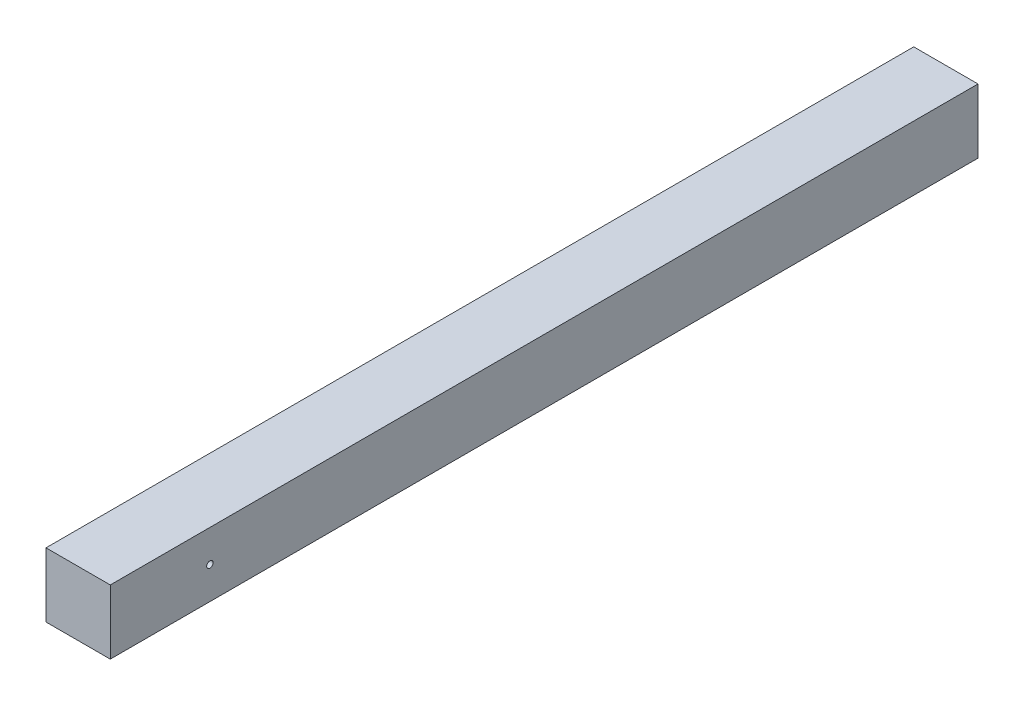
ISO-10303-21;
HEADER;
FILE_DESCRIPTION(('STEP AP214'),'2;1');
FILE_NAME('part.step','',(''),(''),'','','');
FILE_SCHEMA(('AUTOMOTIVE_DESIGN { 1 0 10303 214 1 1 1 1 }'));
ENDSEC;
DATA;
#1=APPLICATION_CONTEXT('core data for automotive mechanical design processes');
#2=APPLICATION_PROTOCOL_DEFINITION('international standard','automotive_design',2000,#1);
#3=PRODUCT_CONTEXT('',#1,'mechanical');
#4=PRODUCT('Part','Part','',(#3));
#5=PRODUCT_RELATED_PRODUCT_CATEGORY('part','',(#4));
#6=PRODUCT_DEFINITION_FORMATION('','',#4);
#7=PRODUCT_DEFINITION_CONTEXT('part definition',#1,'design');
#8=PRODUCT_DEFINITION('design','',#6,#7);
#9=PRODUCT_DEFINITION_SHAPE('','',#8);
#10=(LENGTH_UNIT() NAMED_UNIT(*) SI_UNIT(.MILLI.,.METRE.));
#11=(NAMED_UNIT(*) PLANE_ANGLE_UNIT() SI_UNIT($,.RADIAN.));
#12=(NAMED_UNIT(*) SI_UNIT($,.STERADIAN.) SOLID_ANGLE_UNIT());
#13=UNCERTAINTY_MEASURE_WITH_UNIT(LENGTH_MEASURE(1.E-05),#10,'distance_accuracy_value','');
#14=(GEOMETRIC_REPRESENTATION_CONTEXT(3) GLOBAL_UNCERTAINTY_ASSIGNED_CONTEXT((#13)) GLOBAL_UNIT_ASSIGNED_CONTEXT((#10,
#11,#12)) REPRESENTATION_CONTEXT('',''));
#15=CARTESIAN_POINT('',(0.,0.,0.));
#16=DIRECTION('',(0.,0.,1.));
#17=DIRECTION('',(1.,0.,0.));
#18=AXIS2_PLACEMENT_3D('',#15,#16,#17);
#19=CARTESIAN_POINT('',(50.,50.,675.));
#20=DIRECTION('',(-1.,0.,0.));
#21=DIRECTION('',(0.,0.,1.));
#22=AXIS2_PLACEMENT_3D('',#19,#20,#21);
#23=PLANE('',#22);
#24=CARTESIAN_POINT('',(50.,0.,520.));
#25=DIRECTION('',(-1.,0.,0.));
#26=DIRECTION('',(0.,0.,1.));
#27=AXIS2_PLACEMENT_3D('',#24,#25,#26);
#28=CIRCLE('',#27,5.00000000000004);
#29=CARTESIAN_POINT('',(50.,0.,525.));
#30=VERTEX_POINT('',#29);
#31=EDGE_CURVE('E103',#30,#30,#28,.T.);
#32=ORIENTED_EDGE('',*,*,#31,.T.);
#33=EDGE_LOOP('',(#32));
#34=FACE_BOUND('',#33,.T.);
#35=DIRECTION('',(0.,1.,0.));
#36=VECTOR('',#35,1.);
#37=CARTESIAN_POINT('',(50.,50.,-675.));
#38=LINE('',#37,#36);
#39=CARTESIAN_POINT('',(50.,-50.,-675.));
#40=VERTEX_POINT('',#39);
#41=CARTESIAN_POINT('',(50.,50.,-675.));
#42=VERTEX_POINT('',#41);
#43=EDGE_CURVE('E100',#40,#42,#38,.T.);
#44=ORIENTED_EDGE('',*,*,#43,.T.);
#45=DIRECTION('',(0.,0.,-1.));
#46=VECTOR('',#45,1.);
#47=CARTESIAN_POINT('',(50.,50.,675.));
#48=LINE('',#47,#46);
#49=CARTESIAN_POINT('',(50.,50.,675.));
#50=VERTEX_POINT('',#49);
#51=EDGE_CURVE('E11',#50,#42,#48,.T.);
#52=ORIENTED_EDGE('',*,*,#51,.F.);
#53=DIRECTION('',(0.,1.,0.));
#54=VECTOR('',#53,1.);
#55=CARTESIAN_POINT('',(50.,50.,675.));
#56=LINE('',#55,#54);
#57=CARTESIAN_POINT('',(50.,-50.,675.));
#58=VERTEX_POINT('',#57);
#59=EDGE_CURVE('E88',#58,#50,#56,.T.);
#60=ORIENTED_EDGE('',*,*,#59,.F.);
#61=DIRECTION('',(0.,0.,-1.));
#62=VECTOR('',#61,1.);
#63=CARTESIAN_POINT('',(50.,-50.,675.));
#64=LINE('',#63,#62);
#65=EDGE_CURVE('E96',#58,#40,#64,.T.);
#66=ORIENTED_EDGE('',*,*,#65,.T.);
#67=EDGE_LOOP('',(#44,#52,#60,#66));
#68=FACE_BOUND('',#67,.T.);
#69=ADVANCED_FACE('F37',(#34,#68),#23,.F.);
#70=CARTESIAN_POINT('',(-50.,50.,675.));
#71=DIRECTION('',(0.,-1.,0.));
#72=DIRECTION('',(0.,0.,-1.));
#73=AXIS2_PLACEMENT_3D('',#70,#71,#72);
#74=PLANE('',#73);
#75=DIRECTION('',(-1.,0.,0.));
#76=VECTOR('',#75,1.);
#77=CARTESIAN_POINT('',(-50.,50.,-675.));
#78=LINE('',#77,#76);
#79=CARTESIAN_POINT('',(-50.,50.,-675.));
#80=VERTEX_POINT('',#79);
#81=EDGE_CURVE('E92',#42,#80,#78,.T.);
#82=ORIENTED_EDGE('',*,*,#81,.T.);
#83=DIRECTION('',(0.,0.,-1.));
#84=VECTOR('',#83,1.);
#85=CARTESIAN_POINT('',(-50.,50.,675.));
#86=LINE('',#85,#84);
#87=CARTESIAN_POINT('',(-50.,50.,675.));
#88=VERTEX_POINT('',#87);
#89=EDGE_CURVE('E45',#88,#80,#86,.T.);
#90=ORIENTED_EDGE('',*,*,#89,.F.);
#91=DIRECTION('',(-1.,0.,0.));
#92=VECTOR('',#91,1.);
#93=CARTESIAN_POINT('',(-50.,50.,675.));
#94=LINE('',#93,#92);
#95=EDGE_CURVE('E83',#50,#88,#94,.T.);
#96=ORIENTED_EDGE('',*,*,#95,.F.);
#97=ORIENTED_EDGE('',*,*,#51,.T.);
#98=EDGE_LOOP('',(#82,#90,#96,#97));
#99=FACE_BOUND('',#98,.T.);
#100=ADVANCED_FACE('F91',(#99),#74,.F.);
#101=CARTESIAN_POINT('',(-50.,50.,675.));
#102=DIRECTION('',(1.,0.,0.));
#103=DIRECTION('',(0.,0.,-1.));
#104=AXIS2_PLACEMENT_3D('',#101,#102,#103);
#105=PLANE('',#104);
#106=CARTESIAN_POINT('',(-50.,0.,520.));
#107=DIRECTION('',(-1.,0.,0.));
#108=DIRECTION('',(0.,0.,1.));
#109=AXIS2_PLACEMENT_3D('',#106,#107,#108);
#110=CIRCLE('',#109,5.00000000000004);
#111=CARTESIAN_POINT('',(-50.,0.,525.));
#112=VERTEX_POINT('',#111);
#113=EDGE_CURVE('E114',#112,#112,#110,.T.);
#114=ORIENTED_EDGE('',*,*,#113,.F.);
#115=EDGE_LOOP('',(#114));
#116=FACE_BOUND('',#115,.T.);
#117=DIRECTION('',(0.,-1.,0.));
#118=VECTOR('',#117,1.);
#119=CARTESIAN_POINT('',(-50.,50.,-675.));
#120=LINE('',#119,#118);
#121=CARTESIAN_POINT('',(-50.,-50.,-675.));
#122=VERTEX_POINT('',#121);
#123=EDGE_CURVE('E70',#80,#122,#120,.T.);
#124=ORIENTED_EDGE('',*,*,#123,.T.);
#125=DIRECTION('',(0.,0.,-1.));
#126=VECTOR('',#125,1.);
#127=CARTESIAN_POINT('',(-50.,-50.,675.));
#128=LINE('',#127,#126);
#129=CARTESIAN_POINT('',(-50.,-50.,675.));
#130=VERTEX_POINT('',#129);
#131=EDGE_CURVE('E93',#130,#122,#128,.T.);
#132=ORIENTED_EDGE('',*,*,#131,.F.);
#133=DIRECTION('',(0.,-1.,0.));
#134=VECTOR('',#133,1.);
#135=CARTESIAN_POINT('',(-50.,50.,675.));
#136=LINE('',#135,#134);
#137=EDGE_CURVE('E86',#88,#130,#136,.T.);
#138=ORIENTED_EDGE('',*,*,#137,.F.);
#139=ORIENTED_EDGE('',*,*,#89,.T.);
#140=EDGE_LOOP('',(#124,#132,#138,#139));
#141=FACE_BOUND('',#140,.T.);
#142=ADVANCED_FACE('F94',(#116,#141),#105,.F.);
#143=CARTESIAN_POINT('',(-50.,-50.,675.));
#144=DIRECTION('',(0.,1.,0.));
#145=DIRECTION('',(0.,0.,1.));
#146=AXIS2_PLACEMENT_3D('',#143,#144,#145);
#147=PLANE('',#146);
#148=DIRECTION('',(1.,0.,0.));
#149=VECTOR('',#148,1.);
#150=CARTESIAN_POINT('',(-50.,-50.,-675.));
#151=LINE('',#150,#149);
#152=EDGE_CURVE('E76',#122,#40,#151,.T.);
#153=ORIENTED_EDGE('',*,*,#152,.T.);
#154=ORIENTED_EDGE('',*,*,#65,.F.);
#155=DIRECTION('',(1.,0.,0.));
#156=VECTOR('',#155,1.);
#157=CARTESIAN_POINT('',(-50.,-50.,675.));
#158=LINE('',#157,#156);
#159=EDGE_CURVE('E53',#130,#58,#158,.T.);
#160=ORIENTED_EDGE('',*,*,#159,.F.);
#161=ORIENTED_EDGE('',*,*,#131,.T.);
#162=EDGE_LOOP('',(#153,#154,#160,#161));
#163=FACE_BOUND('',#162,.T.);
#164=ADVANCED_FACE('F108',(#163),#147,.F.);
#165=CARTESIAN_POINT('',(0.,0.,675.));
#166=DIRECTION('',(0.,0.,1.));
#167=DIRECTION('',(1.,0.,0.));
#168=AXIS2_PLACEMENT_3D('',#165,#166,#167);
#169=PLANE('',#168);
#170=ORIENTED_EDGE('',*,*,#59,.T.);
#171=ORIENTED_EDGE('',*,*,#95,.T.);
#172=ORIENTED_EDGE('',*,*,#137,.T.);
#173=ORIENTED_EDGE('',*,*,#159,.T.);
#174=EDGE_LOOP('',(#170,#171,#172,#173));
#175=FACE_BOUND('',#174,.T.);
#176=ADVANCED_FACE('F84',(#175),#169,.T.);
#177=CARTESIAN_POINT('',(0.,0.,-675.));
#178=DIRECTION('',(0.,0.,1.));
#179=DIRECTION('',(1.,0.,0.));
#180=AXIS2_PLACEMENT_3D('',#177,#178,#179);
#181=PLANE('',#180);
#182=ORIENTED_EDGE('',*,*,#43,.F.);
#183=ORIENTED_EDGE('',*,*,#152,.F.);
#184=ORIENTED_EDGE('',*,*,#123,.F.);
#185=ORIENTED_EDGE('',*,*,#81,.F.);
#186=EDGE_LOOP('',(#182,#183,#184,#185));
#187=FACE_BOUND('',#186,.T.);
#188=ADVANCED_FACE('F111',(#187),#181,.F.);
#189=CARTESIAN_POINT('',(50.,0.,520.));
#190=DIRECTION('',(-1.,0.,0.));
#191=DIRECTION('',(0.,0.,1.));
#192=AXIS2_PLACEMENT_3D('',#189,#190,#191);
#193=CYLINDRICAL_SURFACE('',#192,5.00000000000004);
#194=ORIENTED_EDGE('',*,*,#31,.F.);
#195=EDGE_LOOP('',(#194));
#196=FACE_BOUND('',#195,.T.);
#197=ORIENTED_EDGE('',*,*,#113,.T.);
#198=EDGE_LOOP('',(#197));
#199=FACE_BOUND('',#198,.T.);
#200=ADVANCED_FACE('F121',(#196,#199),#193,.F.);
#201=CLOSED_SHELL('',(#69,#100,#142,#164,#176,#188,#200));
#202=MANIFOLD_SOLID_BREP('B2',#201);
#203=ADVANCED_BREP_SHAPE_REPRESENTATION('',(#18,#202),#14);
#204=SHAPE_DEFINITION_REPRESENTATION(#9,#203);
ENDSEC;
END-ISO-10303-21;
